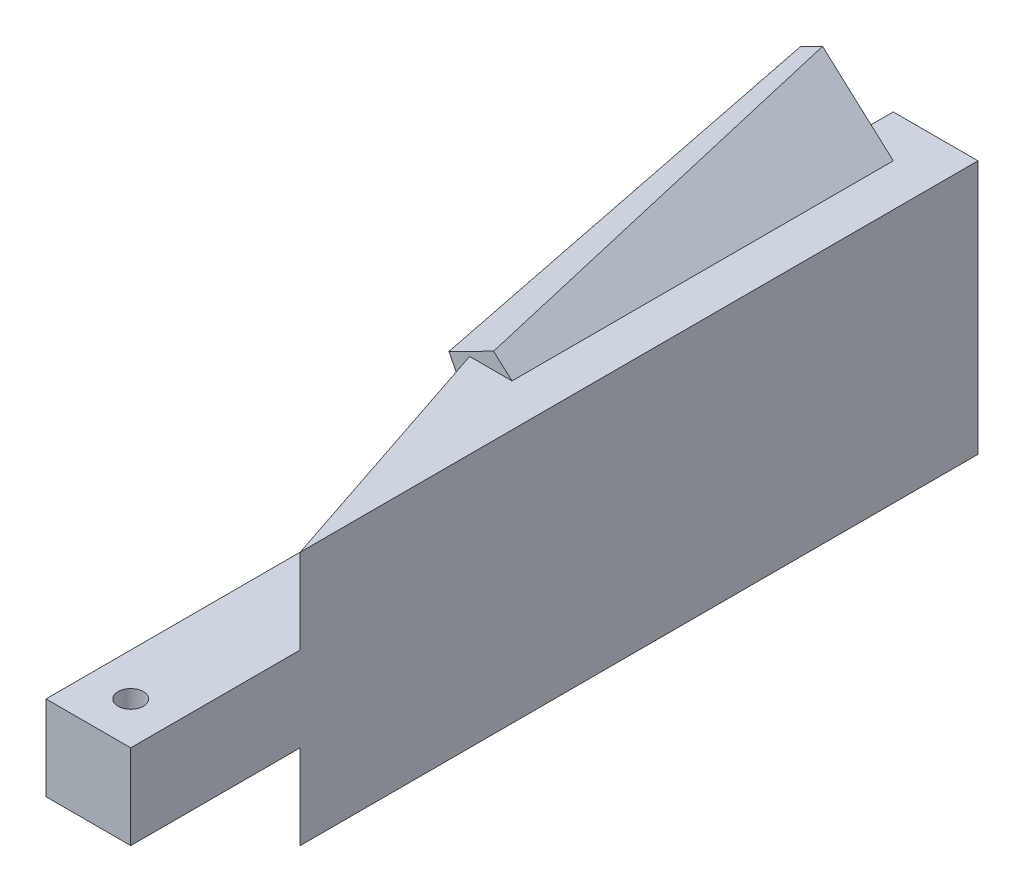
ISO-10303-21;
HEADER;
FILE_DESCRIPTION(('STEP AP214'),'2;1');
FILE_NAME('part.step','',(''),(''),'','','');
FILE_SCHEMA(('AUTOMOTIVE_DESIGN { 1 0 10303 214 1 1 1 1 }'));
ENDSEC;
DATA;
#1=APPLICATION_CONTEXT('core data for automotive mechanical design processes');
#2=APPLICATION_PROTOCOL_DEFINITION('international standard','automotive_design',2000,#1);
#3=PRODUCT_CONTEXT('',#1,'mechanical');
#4=PRODUCT('Part','Part','',(#3));
#5=PRODUCT_RELATED_PRODUCT_CATEGORY('part','',(#4));
#6=PRODUCT_DEFINITION_FORMATION('','',#4);
#7=PRODUCT_DEFINITION_CONTEXT('part definition',#1,'design');
#8=PRODUCT_DEFINITION('design','',#6,#7);
#9=PRODUCT_DEFINITION_SHAPE('','',#8);
#10=(LENGTH_UNIT() NAMED_UNIT(*) SI_UNIT(.MILLI.,.METRE.));
#11=(NAMED_UNIT(*) PLANE_ANGLE_UNIT() SI_UNIT($,.RADIAN.));
#12=(NAMED_UNIT(*) SI_UNIT($,.STERADIAN.) SOLID_ANGLE_UNIT());
#13=UNCERTAINTY_MEASURE_WITH_UNIT(LENGTH_MEASURE(1.E-05),#10,'distance_accuracy_value','');
#14=(GEOMETRIC_REPRESENTATION_CONTEXT(3) GLOBAL_UNCERTAINTY_ASSIGNED_CONTEXT((#13)) GLOBAL_UNIT_ASSIGNED_CONTEXT((#10,
#11,#12)) REPRESENTATION_CONTEXT('',''));
#15=CARTESIAN_POINT('',(0.,0.,0.));
#16=DIRECTION('',(0.,0.,1.));
#17=DIRECTION('',(1.,0.,0.));
#18=AXIS2_PLACEMENT_3D('',#15,#16,#17);
#19=CARTESIAN_POINT('',(19.0641266594902,-21.2208507290396,55.));
#20=DIRECTION('',(0.892764725443748,-0.450523190305836,0.));
#21=DIRECTION('',(0.450523190305836,0.892764725443748,0.));
#22=AXIS2_PLACEMENT_3D('',#19,#20,#21);
#23=PLANE('',#22);
#24=DIRECTION('',(0.450523190305836,0.892764725443748,0.));
#25=VECTOR('',#24,1.);
#26=CARTESIAN_POINT('',(19.0641266594902,-21.2208507290396,10.));
#27=LINE('',#26,#25);
#28=CARTESIAN_POINT('',(19.0641266594902,-21.2208507290395,10.));
#29=VERTEX_POINT('',#28);
#30=CARTESIAN_POINT('',(25.,-9.45821908845376,10.));
#31=VERTEX_POINT('',#30);
#32=EDGE_CURVE('E187',#29,#31,#27,.T.);
#33=ORIENTED_EDGE('',*,*,#32,.F.);
#34=DIRECTION('',(0.0765279350435817,0.151649110163631,0.985467413233205));
#35=VECTOR('',#34,1.);
#36=CARTESIAN_POINT('',(22.558668468501,-14.2960048480642,55.));
#37=LINE('',#36,#35);
#38=CARTESIAN_POINT('',(22.558668468501,-14.2960048480642,55.));
#39=VERTEX_POINT('',#38);
#40=EDGE_CURVE('E191',#29,#39,#37,.T.);
#41=ORIENTED_EDGE('',*,*,#40,.T.);
#42=DIRECTION('',(-0.450523190305836,-0.892764725443748,0.));
#43=VECTOR('',#42,1.);
#44=CARTESIAN_POINT('',(19.0641266594902,-21.2208507290396,55.));
#45=LINE('',#44,#43);
#46=CARTESIAN_POINT('',(25.,-9.45821908845373,55.));
#47=VERTEX_POINT('',#46);
#48=EDGE_CURVE('E200',#47,#39,#45,.T.);
#49=ORIENTED_EDGE('',*,*,#48,.F.);
#50=DIRECTION('',(0.,0.,-1.));
#51=VECTOR('',#50,1.);
#52=CARTESIAN_POINT('',(25.,-9.45821908845373,55.));
#53=LINE('',#52,#51);
#54=EDGE_CURVE('E204',#47,#31,#53,.T.);
#55=ORIENTED_EDGE('',*,*,#54,.T.);
#56=EDGE_LOOP('',(#33,#41,#49,#55));
#57=FACE_BOUND('',#56,.T.);
#58=ADVANCED_FACE('F38',(#57),#23,.F.);
#59=CARTESIAN_POINT('',(30.,-15.,55.));
#60=DIRECTION('',(-0.669881862241489,0.742467703432193,0.));
#61=DIRECTION('',(-0.742467703432193,-0.669881862241489,0.));
#62=AXIS2_PLACEMENT_3D('',#59,#60,#61);
#63=PLANE('',#62);
#64=DIRECTION('',(-0.742467703432193,-0.669881862241489,0.));
#65=VECTOR('',#64,1.);
#66=CARTESIAN_POINT('',(30.,-15.,10.));
#67=LINE('',#66,#65);
#68=CARTESIAN_POINT('',(30.,-15.,10.));
#69=VERTEX_POINT('',#68);
#70=CARTESIAN_POINT('',(21.6556139021278,-22.5286142045842,10.));
#71=VERTEX_POINT('',#70);
#72=EDGE_CURVE('E53',#69,#71,#67,.T.);
#73=ORIENTED_EDGE('',*,*,#72,.F.);
#74=DIRECTION('',(0.,0.,-1.));
#75=VECTOR('',#74,1.);
#76=CARTESIAN_POINT('',(30.,-15.,55.));
#77=LINE('',#76,#75);
#78=CARTESIAN_POINT('',(30.,-15.,55.));
#79=VERTEX_POINT('',#78);
#80=EDGE_CURVE('E203',#79,#69,#77,.T.);
#81=ORIENTED_EDGE('',*,*,#80,.F.);
#82=DIRECTION('',(0.742467703432193,0.669881862241489,0.));
#83=VECTOR('',#82,1.);
#84=CARTESIAN_POINT('',(30.,-15.,55.));
#85=LINE('',#84,#83);
#86=CARTESIAN_POINT('',(27.8312326849423,-16.9567422004532,55.));
#87=VERTEX_POINT('',#86);
#88=EDGE_CURVE('E197',#87,#79,#85,.T.);
#89=ORIENTED_EDGE('',*,*,#88,.F.);
#90=DIRECTION('',(0.13495005262416,0.121756935882283,0.983343140445539));
#91=VECTOR('',#90,1.);
#92=CARTESIAN_POINT('',(27.902880663493,-16.8920987404407,55.52207870145));
#93=LINE('',#92,#91);
#94=EDGE_CURVE('E12',#71,#87,#93,.T.);
#95=ORIENTED_EDGE('',*,*,#94,.F.);
#96=EDGE_LOOP('',(#73,#81,#89,#95));
#97=FACE_BOUND('',#96,.T.);
#98=ADVANCED_FACE('F323',(#97),#63,.F.);
#99=CARTESIAN_POINT('',(35.,-90.5,5.));
#100=DIRECTION('',(0.,0.,-1.));
#101=DIRECTION('',(-1.,0.,0.));
#102=AXIS2_PLACEMENT_3D('',#99,#100,#101);
#103=PLANE('',#102);
#104=DIRECTION('',(0.,1.,0.));
#105=VECTOR('',#104,1.);
#106=CARTESIAN_POINT('',(25.,-90.5,5.));
#107=LINE('',#106,#105);
#108=CARTESIAN_POINT('',(25.,-15.,5.));
#109=VERTEX_POINT('',#108);
#110=CARTESIAN_POINT('',(25.,15.,5.));
#111=VERTEX_POINT('',#110);
#112=EDGE_CURVE('E234',#109,#111,#107,.T.);
#113=ORIENTED_EDGE('',*,*,#112,.T.);
#114=DIRECTION('',(1.,0.,0.));
#115=VECTOR('',#114,1.);
#116=CARTESIAN_POINT('',(35.,15.,5.));
#117=LINE('',#116,#115);
#118=CARTESIAN_POINT('',(35.,15.,5.));
#119=VERTEX_POINT('',#118);
#120=EDGE_CURVE('E46',#111,#119,#117,.T.);
#121=ORIENTED_EDGE('',*,*,#120,.T.);
#122=DIRECTION('',(0.,1.,0.));
#123=VECTOR('',#122,1.);
#124=CARTESIAN_POINT('',(35.,-90.5,5.));
#125=LINE('',#124,#123);
#126=CARTESIAN_POINT('',(35.,-15.,5.));
#127=VERTEX_POINT('',#126);
#128=EDGE_CURVE('E233',#127,#119,#125,.T.);
#129=ORIENTED_EDGE('',*,*,#128,.F.);
#130=DIRECTION('',(-1.,0.,0.));
#131=VECTOR('',#130,1.);
#132=CARTESIAN_POINT('',(35.,-15.,5.));
#133=LINE('',#132,#131);
#134=EDGE_CURVE('E287',#127,#109,#133,.T.);
#135=ORIENTED_EDGE('',*,*,#134,.T.);
#136=EDGE_LOOP('',(#113,#121,#129,#135));
#137=FACE_BOUND('',#136,.T.);
#138=ADVANCED_FACE('F295',(#137),#103,.T.);
#139=CARTESIAN_POINT('',(30.,15.,55.));
#140=DIRECTION('',(0.669881862241489,0.742467703432193,0.));
#141=DIRECTION('',(-0.742467703432193,0.669881862241489,0.));
#142=AXIS2_PLACEMENT_3D('',#139,#140,#141);
#143=PLANE('',#142);
#144=DIRECTION('',(0.,0.,-1.));
#145=VECTOR('',#144,1.);
#146=CARTESIAN_POINT('',(30.,15.,55.));
#147=LINE('',#146,#145);
#148=CARTESIAN_POINT('',(30.,15.,55.));
#149=VERTEX_POINT('',#148);
#150=CARTESIAN_POINT('',(30.,15.,10.));
#151=VERTEX_POINT('',#150);
#152=EDGE_CURVE('E227',#149,#151,#147,.T.);
#153=ORIENTED_EDGE('',*,*,#152,.T.);
#154=DIRECTION('',(-0.742467703432193,0.669881862241489,0.));
#155=VECTOR('',#154,1.);
#156=CARTESIAN_POINT('',(30.,15.,10.));
#157=LINE('',#156,#155);
#158=CARTESIAN_POINT('',(21.6556139021278,22.5286142045842,10.));
#159=VERTEX_POINT('',#158);
#160=EDGE_CURVE('E179',#151,#159,#157,.T.);
#161=ORIENTED_EDGE('',*,*,#160,.T.);
#162=DIRECTION('',(-0.13495005262416,0.121756935882283,-0.983343140445539));
#163=VECTOR('',#162,1.);
#164=CARTESIAN_POINT('',(27.902880663493,16.8920987404407,55.52207870145));
#165=LINE('',#164,#163);
#166=CARTESIAN_POINT('',(27.8312326849423,16.9567422004532,55.));
#167=VERTEX_POINT('',#166);
#168=EDGE_CURVE('E218',#167,#159,#165,.T.);
#169=ORIENTED_EDGE('',*,*,#168,.F.);
#170=DIRECTION('',(0.742467703432193,-0.669881862241489,0.));
#171=VECTOR('',#170,1.);
#172=CARTESIAN_POINT('',(30.,15.,55.));
#173=LINE('',#172,#171);
#174=EDGE_CURVE('E225',#167,#149,#173,.T.);
#175=ORIENTED_EDGE('',*,*,#174,.T.);
#176=EDGE_LOOP('',(#153,#161,#169,#175));
#177=FACE_BOUND('',#176,.T.);
#178=ADVANCED_FACE('F353',(#177),#143,.T.);
#179=CARTESIAN_POINT('',(19.0641266594902,21.2208507290396,55.));
#180=DIRECTION('',(-0.892764725443748,-0.450523190305836,0.));
#181=DIRECTION('',(0.450523190305836,-0.892764725443748,0.));
#182=AXIS2_PLACEMENT_3D('',#179,#180,#181);
#183=PLANE('',#182);
#184=DIRECTION('',(0.0765279350435817,-0.151649110163631,0.985467413233205));
#185=VECTOR('',#184,1.);
#186=CARTESIAN_POINT('',(22.558668468501,14.2960048480642,55.));
#187=LINE('',#186,#185);
#188=CARTESIAN_POINT('',(19.0641266594902,21.2208507290396,9.99999999999999));
#189=VERTEX_POINT('',#188);
#190=CARTESIAN_POINT('',(22.558668468501,14.2960048480642,55.));
#191=VERTEX_POINT('',#190);
#192=EDGE_CURVE('E212',#189,#191,#187,.T.);
#193=ORIENTED_EDGE('',*,*,#192,.F.);
#194=DIRECTION('',(0.450523190305836,-0.892764725443748,0.));
#195=VECTOR('',#194,1.);
#196=CARTESIAN_POINT('',(19.0641266594902,21.2208507290396,10.));
#197=LINE('',#196,#195);
#198=CARTESIAN_POINT('',(25.,9.45821908845373,10.));
#199=VERTEX_POINT('',#198);
#200=EDGE_CURVE('E61',#189,#199,#197,.T.);
#201=ORIENTED_EDGE('',*,*,#200,.T.);
#202=DIRECTION('',(0.,0.,-1.));
#203=VECTOR('',#202,1.);
#204=CARTESIAN_POINT('',(25.,9.45821908845373,55.));
#205=LINE('',#204,#203);
#206=CARTESIAN_POINT('',(25.,9.45821908845373,55.));
#207=VERTEX_POINT('',#206);
#208=EDGE_CURVE('E162',#207,#199,#205,.T.);
#209=ORIENTED_EDGE('',*,*,#208,.F.);
#210=DIRECTION('',(-0.450523190305836,0.892764725443748,0.));
#211=VECTOR('',#210,1.);
#212=CARTESIAN_POINT('',(19.0641266594902,21.2208507290396,55.));
#213=LINE('',#212,#211);
#214=EDGE_CURVE('E222',#207,#191,#213,.T.);
#215=ORIENTED_EDGE('',*,*,#214,.T.);
#216=EDGE_LOOP('',(#193,#201,#209,#215));
#217=FACE_BOUND('',#216,.T.);
#218=ADVANCED_FACE('F356',(#217),#183,.T.);
#219=CARTESIAN_POINT('',(0.,0.,55.));
#220=DIRECTION('',(0.,0.,1.));
#221=DIRECTION('',(1.,0.,0.));
#222=AXIS2_PLACEMENT_3D('',#219,#220,#221);
#223=PLANE('',#222);
#224=ORIENTED_EDGE('',*,*,#48,.T.);
#225=DIRECTION('',(-0.892764725443748,0.450523190305836,0.));
#226=VECTOR('',#225,1.);
#227=CARTESIAN_POINT('',(49.3416102318135,-27.8117005572393,55.));
#228=LINE('',#227,#226);
#229=EDGE_CURVE('E194',#87,#39,#228,.T.);
#230=ORIENTED_EDGE('',*,*,#229,.F.);
#231=ORIENTED_EDGE('',*,*,#88,.T.);
#232=DIRECTION('',(1.,0.,0.));
#233=VECTOR('',#232,1.);
#234=CARTESIAN_POINT('',(25.,-15.,55.));
#235=LINE('',#234,#233);
#236=CARTESIAN_POINT('',(25.,-15.,55.));
#237=VERTEX_POINT('',#236);
#238=EDGE_CURVE('E207',#237,#79,#235,.T.);
#239=ORIENTED_EDGE('',*,*,#238,.F.);
#240=DIRECTION('',(0.,-1.,0.));
#241=VECTOR('',#240,1.);
#242=CARTESIAN_POINT('',(25.,-5.00000000000003,55.));
#243=LINE('',#242,#241);
#244=EDGE_CURVE('E269',#47,#237,#243,.T.);
#245=ORIENTED_EDGE('',*,*,#244,.F.);
#246=EDGE_LOOP('',(#224,#230,#231,#239,#245));
#247=FACE_BOUND('',#246,.T.);
#248=ADVANCED_FACE('F315',(#247),#223,.T.);
#249=CARTESIAN_POINT('',(25.,-15.,105.));
#250=DIRECTION('',(1.,0.,0.));
#251=DIRECTION('',(0.,0.,-1.));
#252=AXIS2_PLACEMENT_3D('',#249,#250,#251);
#253=PLANE('',#252);
#254=ORIENTED_EDGE('',*,*,#112,.F.);
#255=DIRECTION('',(0.,0.,-1.));
#256=VECTOR('',#255,1.);
#257=CARTESIAN_POINT('',(25.,-15.,10.));
#258=LINE('',#257,#256);
#259=CARTESIAN_POINT('',(25.,-15.,10.));
#260=VERTEX_POINT('',#259);
#261=EDGE_CURVE('E175',#260,#109,#258,.T.);
#262=ORIENTED_EDGE('',*,*,#261,.F.);
#263=DIRECTION('',(0.,1.,0.));
#264=VECTOR('',#263,1.);
#265=CARTESIAN_POINT('',(25.,15.,10.));
#266=LINE('',#265,#264);
#267=EDGE_CURVE('E164',#260,#31,#266,.T.);
#268=ORIENTED_EDGE('',*,*,#267,.T.);
#269=ORIENTED_EDGE('',*,*,#54,.F.);
#270=CARTESIAN_POINT('',(25.,-5.00000000000003,55.));
#271=VERTEX_POINT('',#270);
#272=EDGE_CURVE('E275',#271,#47,#243,.T.);
#273=ORIENTED_EDGE('',*,*,#272,.F.);
#274=DIRECTION('',(0.,0.,-1.));
#275=VECTOR('',#274,1.);
#276=CARTESIAN_POINT('',(25.,-5.00000000000003,95.));
#277=LINE('',#276,#275);
#278=CARTESIAN_POINT('',(25.,-5.00000000000003,105.));
#279=VERTEX_POINT('',#278);
#280=EDGE_CURVE('E264',#279,#271,#277,.T.);
#281=ORIENTED_EDGE('',*,*,#280,.F.);
#282=DIRECTION('',(0.,-1.,0.));
#283=VECTOR('',#282,1.);
#284=CARTESIAN_POINT('',(25.,-15.,105.));
#285=LINE('',#284,#283);
#286=CARTESIAN_POINT('',(25.,5.00000000000003,105.));
#287=VERTEX_POINT('',#286);
#288=EDGE_CURVE('E281',#287,#279,#285,.T.);
#289=ORIENTED_EDGE('',*,*,#288,.F.);
#290=DIRECTION('',(0.,0.,-1.));
#291=VECTOR('',#290,1.);
#292=CARTESIAN_POINT('',(25.,5.00000000000003,55.));
#293=LINE('',#292,#291);
#294=CARTESIAN_POINT('',(25.,5.00000000000003,55.));
#295=VERTEX_POINT('',#294);
#296=EDGE_CURVE('E244',#287,#295,#293,.T.);
#297=ORIENTED_EDGE('',*,*,#296,.T.);
#298=DIRECTION('',(0.,1.,0.));
#299=VECTOR('',#298,1.);
#300=CARTESIAN_POINT('',(25.,5.00000000000003,55.));
#301=LINE('',#300,#299);
#302=EDGE_CURVE('E253',#295,#207,#301,.T.);
#303=ORIENTED_EDGE('',*,*,#302,.T.);
#304=ORIENTED_EDGE('',*,*,#208,.T.);
#305=CARTESIAN_POINT('',(25.,15.,10.));
#306=VERTEX_POINT('',#305);
#307=EDGE_CURVE('E156',#199,#306,#266,.T.);
#308=ORIENTED_EDGE('',*,*,#307,.T.);
#309=DIRECTION('',(0.,0.,-1.));
#310=VECTOR('',#309,1.);
#311=CARTESIAN_POINT('',(25.,15.,10.));
#312=LINE('',#311,#310);
#313=EDGE_CURVE('E159',#306,#111,#312,.T.);
#314=ORIENTED_EDGE('',*,*,#313,.T.);
#315=EDGE_LOOP('',(#254,#262,#268,#269,#273,#281,#289,#297,#303,#304,#308,#314));
#316=FACE_BOUND('',#315,.T.);
#317=ADVANCED_FACE('F158',(#316),#253,.F.);
#318=CARTESIAN_POINT('',(25.,-15.,105.));
#319=DIRECTION('',(0.,1.,0.));
#320=DIRECTION('',(-1.,0.,0.));
#321=AXIS2_PLACEMENT_3D('',#318,#319,#320);
#322=PLANE('',#321);
#323=ORIENTED_EDGE('',*,*,#134,.F.);
#324=DIRECTION('',(0.,0.,-1.));
#325=VECTOR('',#324,1.);
#326=CARTESIAN_POINT('',(35.,-15.,105.));
#327=LINE('',#326,#325);
#328=CARTESIAN_POINT('',(35.,-15.,85.));
#329=VERTEX_POINT('',#328);
#330=EDGE_CURVE('E283',#329,#127,#327,.T.);
#331=ORIENTED_EDGE('',*,*,#330,.F.);
#332=DIRECTION('',(0.316227766016838,0.,0.948683298050514));
#333=VECTOR('',#332,1.);
#334=CARTESIAN_POINT('',(35.,-15.,85.));
#335=LINE('',#334,#333);
#336=EDGE_CURVE('E261',#237,#329,#335,.T.);
#337=ORIENTED_EDGE('',*,*,#336,.F.);
#338=ORIENTED_EDGE('',*,*,#238,.T.);
#339=ORIENTED_EDGE('',*,*,#80,.T.);
#340=DIRECTION('',(-1.,0.,0.));
#341=VECTOR('',#340,1.);
#342=CARTESIAN_POINT('',(35.,-15.,10.));
#343=LINE('',#342,#341);
#344=EDGE_CURVE('E165',#69,#260,#343,.T.);
#345=ORIENTED_EDGE('',*,*,#344,.T.);
#346=ORIENTED_EDGE('',*,*,#261,.T.);
#347=EDGE_LOOP('',(#323,#331,#337,#338,#339,#345,#346));
#348=FACE_BOUND('',#347,.T.);
#349=ADVANCED_FACE('F304',(#348),#322,.F.);
#350=CARTESIAN_POINT('',(35.,-15.,105.));
#351=DIRECTION('',(-1.,0.,0.));
#352=DIRECTION('',(0.,0.,1.));
#353=AXIS2_PLACEMENT_3D('',#350,#351,#352);
#354=PLANE('',#353);
#355=ORIENTED_EDGE('',*,*,#128,.T.);
#356=DIRECTION('',(0.,0.,-1.));
#357=VECTOR('',#356,1.);
#358=CARTESIAN_POINT('',(35.,15.,105.));
#359=LINE('',#358,#357);
#360=CARTESIAN_POINT('',(35.,15.,85.));
#361=VERTEX_POINT('',#360);
#362=EDGE_CURVE('E285',#361,#119,#359,.T.);
#363=ORIENTED_EDGE('',*,*,#362,.F.);
#364=DIRECTION('',(0.,1.,0.));
#365=VECTOR('',#364,1.);
#366=CARTESIAN_POINT('',(35.,5.00000000000003,85.));
#367=LINE('',#366,#365);
#368=CARTESIAN_POINT('',(35.,5.00000000000003,85.));
#369=VERTEX_POINT('',#368);
#370=EDGE_CURVE('E250',#369,#361,#367,.T.);
#371=ORIENTED_EDGE('',*,*,#370,.F.);
#372=DIRECTION('',(0.,0.,1.));
#373=VECTOR('',#372,1.);
#374=CARTESIAN_POINT('',(35.,5.00000000000003,85.));
#375=LINE('',#374,#373);
#376=CARTESIAN_POINT('',(35.,5.00000000000003,105.));
#377=VERTEX_POINT('',#376);
#378=EDGE_CURVE('E239',#369,#377,#375,.T.);
#379=ORIENTED_EDGE('',*,*,#378,.T.);
#380=DIRECTION('',(0.,1.,0.));
#381=VECTOR('',#380,1.);
#382=CARTESIAN_POINT('',(35.,-15.,105.));
#383=LINE('',#382,#381);
#384=CARTESIAN_POINT('',(35.,-5.00000000000003,105.));
#385=VERTEX_POINT('',#384);
#386=EDGE_CURVE('E278',#385,#377,#383,.T.);
#387=ORIENTED_EDGE('',*,*,#386,.F.);
#388=DIRECTION('',(0.,0.,1.));
#389=VECTOR('',#388,1.);
#390=CARTESIAN_POINT('',(35.,-5.00000000000003,85.));
#391=LINE('',#390,#389);
#392=CARTESIAN_POINT('',(35.,-5.00000000000003,85.));
#393=VERTEX_POINT('',#392);
#394=EDGE_CURVE('E258',#393,#385,#391,.T.);
#395=ORIENTED_EDGE('',*,*,#394,.F.);
#396=DIRECTION('',(0.,-1.,0.));
#397=VECTOR('',#396,1.);
#398=CARTESIAN_POINT('',(35.,-5.00000000000003,85.));
#399=LINE('',#398,#397);
#400=EDGE_CURVE('E271',#393,#329,#399,.T.);
#401=ORIENTED_EDGE('',*,*,#400,.T.);
#402=ORIENTED_EDGE('',*,*,#330,.T.);
#403=EDGE_LOOP('',(#355,#363,#371,#379,#387,#395,#401,#402));
#404=FACE_BOUND('',#403,.T.);
#405=ADVANCED_FACE('F40',(#404),#354,.F.);
#406=CARTESIAN_POINT('',(25.,15.,105.));
#407=DIRECTION('',(0.,-1.,0.));
#408=DIRECTION('',(1.,0.,0.));
#409=AXIS2_PLACEMENT_3D('',#406,#407,#408);
#410=PLANE('',#409);
#411=ORIENTED_EDGE('',*,*,#120,.F.);
#412=ORIENTED_EDGE('',*,*,#313,.F.);
#413=DIRECTION('',(1.,0.,0.));
#414=VECTOR('',#413,1.);
#415=CARTESIAN_POINT('',(35.,15.,10.));
#416=LINE('',#415,#414);
#417=EDGE_CURVE('E171',#306,#151,#416,.T.);
#418=ORIENTED_EDGE('',*,*,#417,.T.);
#419=ORIENTED_EDGE('',*,*,#152,.F.);
#420=DIRECTION('',(-1.,0.,0.));
#421=VECTOR('',#420,1.);
#422=CARTESIAN_POINT('',(25.,15.,55.));
#423=LINE('',#422,#421);
#424=CARTESIAN_POINT('',(25.,15.,55.));
#425=VERTEX_POINT('',#424);
#426=EDGE_CURVE('E229',#149,#425,#423,.T.);
#427=ORIENTED_EDGE('',*,*,#426,.T.);
#428=DIRECTION('',(0.316227766016838,0.,0.948683298050514));
#429=VECTOR('',#428,1.);
#430=CARTESIAN_POINT('',(35.,15.,85.));
#431=LINE('',#430,#429);
#432=EDGE_CURVE('E236',#425,#361,#431,.T.);
#433=ORIENTED_EDGE('',*,*,#432,.T.);
#434=ORIENTED_EDGE('',*,*,#362,.T.);
#435=EDGE_LOOP('',(#411,#412,#418,#419,#427,#433,#434));
#436=FACE_BOUND('',#435,.T.);
#437=ADVANCED_FACE('F169',(#436),#410,.F.);
#438=CARTESIAN_POINT('',(0.,0.,105.));
#439=DIRECTION('',(0.,0.,-1.));
#440=DIRECTION('',(-1.,0.,0.));
#441=AXIS2_PLACEMENT_3D('',#438,#439,#440);
#442=PLANE('',#441);
#443=ORIENTED_EDGE('',*,*,#386,.T.);
#444=DIRECTION('',(-1.,0.,0.));
#445=VECTOR('',#444,1.);
#446=CARTESIAN_POINT('',(25.,5.00000000000003,105.));
#447=LINE('',#446,#445);
#448=EDGE_CURVE('E247',#377,#287,#447,.T.);
#449=ORIENTED_EDGE('',*,*,#448,.T.);
#450=ORIENTED_EDGE('',*,*,#288,.T.);
#451=DIRECTION('',(-1.,0.,0.));
#452=VECTOR('',#451,1.);
#453=CARTESIAN_POINT('',(25.,-5.00000000000003,105.));
#454=LINE('',#453,#452);
#455=EDGE_CURVE('E260',#385,#279,#454,.T.);
#456=ORIENTED_EDGE('',*,*,#455,.F.);
#457=EDGE_LOOP('',(#443,#449,#450,#456));
#458=FACE_BOUND('',#457,.T.);
#459=ADVANCED_FACE('F379',(#458),#442,.F.);
#460=CARTESIAN_POINT('',(30.,35.,100.));
#461=DIRECTION('',(0.,-1.,0.));
#462=DIRECTION('',(1.,0.,0.));
#463=AXIS2_PLACEMENT_3D('',#460,#461,#462);
#464=CYLINDRICAL_SURFACE('',#463,1.50000000000001);
#465=CARTESIAN_POINT('',(30.,5.00000000000003,100.));
#466=DIRECTION('',(0.,-1.,0.));
#467=DIRECTION('',(1.,0.,0.));
#468=AXIS2_PLACEMENT_3D('',#465,#466,#467);
#469=CIRCLE('',#468,1.50000000000001);
#470=CARTESIAN_POINT('',(31.5,5.00000000000003,100.));
#471=VERTEX_POINT('',#470);
#472=EDGE_CURVE('E255',#471,#471,#469,.F.);
#473=ORIENTED_EDGE('',*,*,#472,.T.);
#474=EDGE_LOOP('',(#473));
#475=FACE_BOUND('',#474,.T.);
#476=CARTESIAN_POINT('',(30.,-5.00000000000003,100.));
#477=DIRECTION('',(0.,1.,0.));
#478=DIRECTION('',(-1.,0.,0.));
#479=AXIS2_PLACEMENT_3D('',#476,#477,#478);
#480=CIRCLE('',#479,1.50000000000001);
#481=CARTESIAN_POINT('',(28.5,-5.00000000000003,100.));
#482=VERTEX_POINT('',#481);
#483=EDGE_CURVE('E274',#482,#482,#480,.F.);
#484=ORIENTED_EDGE('',*,*,#483,.T.);
#485=EDGE_LOOP('',(#484));
#486=FACE_BOUND('',#485,.T.);
#487=ADVANCED_FACE('F373',(#475,#486),#464,.F.);
#488=CARTESIAN_POINT('',(0.,-5.00000000000002,0.));
#489=DIRECTION('',(0.,1.,0.));
#490=DIRECTION('',(-1.,0.,0.));
#491=AXIS2_PLACEMENT_3D('',#488,#489,#490);
#492=PLANE('',#491);
#493=ORIENTED_EDGE('',*,*,#394,.T.);
#494=ORIENTED_EDGE('',*,*,#455,.T.);
#495=ORIENTED_EDGE('',*,*,#280,.T.);
#496=DIRECTION('',(0.316227766016838,0.,0.948683298050514));
#497=VECTOR('',#496,1.);
#498=CARTESIAN_POINT('',(35.,-5.00000000000003,85.));
#499=LINE('',#498,#497);
#500=EDGE_CURVE('E266',#271,#393,#499,.T.);
#501=ORIENTED_EDGE('',*,*,#500,.T.);
#502=EDGE_LOOP('',(#493,#494,#495,#501));
#503=FACE_BOUND('',#502,.T.);
#504=ORIENTED_EDGE('',*,*,#483,.F.);
#505=EDGE_LOOP('',(#504));
#506=FACE_BOUND('',#505,.T.);
#507=ADVANCED_FACE('F370',(#503,#506),#492,.F.);
#508=CARTESIAN_POINT('',(35.,-5.00000000000003,85.));
#509=DIRECTION('',(0.948683298050514,0.,-0.316227766016838));
#510=DIRECTION('',(-0.316227766016838,0.,-0.948683298050514));
#511=AXIS2_PLACEMENT_3D('',#508,#509,#510);
#512=PLANE('',#511);
#513=ORIENTED_EDGE('',*,*,#336,.T.);
#514=ORIENTED_EDGE('',*,*,#400,.F.);
#515=ORIENTED_EDGE('',*,*,#500,.F.);
#516=ORIENTED_EDGE('',*,*,#272,.T.);
#517=ORIENTED_EDGE('',*,*,#244,.T.);
#518=EDGE_LOOP('',(#513,#514,#515,#516,#517));
#519=FACE_BOUND('',#518,.T.);
#520=ADVANCED_FACE('F319',(#519),#512,.F.);
#521=CARTESIAN_POINT('',(0.,5.00000000000002,0.));
#522=DIRECTION('',(0.,-1.,0.));
#523=DIRECTION('',(-1.,0.,0.));
#524=AXIS2_PLACEMENT_3D('',#521,#522,#523);
#525=PLANE('',#524);
#526=ORIENTED_EDGE('',*,*,#378,.F.);
#527=DIRECTION('',(0.316227766016838,0.,0.948683298050514));
#528=VECTOR('',#527,1.);
#529=CARTESIAN_POINT('',(35.,5.00000000000003,85.));
#530=LINE('',#529,#528);
#531=EDGE_CURVE('E242',#295,#369,#530,.T.);
#532=ORIENTED_EDGE('',*,*,#531,.F.);
#533=ORIENTED_EDGE('',*,*,#296,.F.);
#534=ORIENTED_EDGE('',*,*,#448,.F.);
#535=EDGE_LOOP('',(#526,#532,#533,#534));
#536=FACE_BOUND('',#535,.T.);
#537=ORIENTED_EDGE('',*,*,#472,.F.);
#538=EDGE_LOOP('',(#537));
#539=FACE_BOUND('',#538,.T.);
#540=ADVANCED_FACE('F363',(#536,#539),#525,.F.);
#541=CARTESIAN_POINT('',(35.,5.00000000000003,85.));
#542=DIRECTION('',(-0.948683298050514,0.,0.316227766016838));
#543=DIRECTION('',(0.316227766016838,0.,0.948683298050514));
#544=AXIS2_PLACEMENT_3D('',#541,#542,#543);
#545=PLANE('',#544);
#546=ORIENTED_EDGE('',*,*,#432,.F.);
#547=EDGE_CURVE('E256',#207,#425,#301,.T.);
#548=ORIENTED_EDGE('',*,*,#547,.F.);
#549=ORIENTED_EDGE('',*,*,#302,.F.);
#550=ORIENTED_EDGE('',*,*,#531,.T.);
#551=ORIENTED_EDGE('',*,*,#370,.T.);
#552=EDGE_LOOP('',(#546,#548,#549,#550,#551));
#553=FACE_BOUND('',#552,.T.);
#554=ADVANCED_FACE('F351',(#553),#545,.T.);
#555=CARTESIAN_POINT('',(0.,0.,55.));
#556=DIRECTION('',(0.,0.,1.));
#557=DIRECTION('',(1.,0.,0.));
#558=AXIS2_PLACEMENT_3D('',#555,#556,#557);
#559=PLANE('',#558);
#560=DIRECTION('',(-0.892764725443748,-0.450523190305836,0.));
#561=VECTOR('',#560,1.);
#562=CARTESIAN_POINT('',(49.3416102318135,27.8117005572393,55.));
#563=LINE('',#562,#561);
#564=EDGE_CURVE('E215',#167,#191,#563,.T.);
#565=ORIENTED_EDGE('',*,*,#564,.T.);
#566=ORIENTED_EDGE('',*,*,#214,.F.);
#567=ORIENTED_EDGE('',*,*,#547,.T.);
#568=ORIENTED_EDGE('',*,*,#426,.F.);
#569=ORIENTED_EDGE('',*,*,#174,.F.);
#570=EDGE_LOOP('',(#565,#566,#567,#568,#569));
#571=FACE_BOUND('',#570,.T.);
#572=ADVANCED_FACE('F347',(#571),#559,.T.);
#573=CARTESIAN_POINT('',(49.3416102318135,27.8117005572393,55.));
#574=DIRECTION('',(0.443975922952263,-0.879790544608903,-0.169864585642375));
#575=DIRECTION('',(0.892764725443748,0.450523190305836,0.));
#576=AXIS2_PLACEMENT_3D('',#573,#574,#575);
#577=PLANE('',#576);
#578=ORIENTED_EDGE('',*,*,#168,.T.);
#579=DIRECTION('',(-0.892764725443748,-0.450523190305836,0.));
#580=VECTOR('',#579,1.);
#581=CARTESIAN_POINT('',(45.8470684228026,34.7365464382146,10.));
#582=LINE('',#581,#580);
#583=EDGE_CURVE('E214',#159,#189,#582,.T.);
#584=ORIENTED_EDGE('',*,*,#583,.T.);
#585=ORIENTED_EDGE('',*,*,#192,.T.);
#586=ORIENTED_EDGE('',*,*,#564,.F.);
#587=EDGE_LOOP('',(#578,#584,#585,#586));
#588=FACE_BOUND('',#587,.T.);
#589=ADVANCED_FACE('F334',(#588),#577,.F.);
#590=CARTESIAN_POINT('',(49.3416102318135,-27.8117005572393,55.));
#591=DIRECTION('',(-0.443975922952263,-0.879790544608903,0.169864585642375));
#592=DIRECTION('',(0.892764725443748,-0.450523190305836,0.));
#593=AXIS2_PLACEMENT_3D('',#590,#591,#592);
#594=PLANE('',#593);
#595=ORIENTED_EDGE('',*,*,#94,.T.);
#596=ORIENTED_EDGE('',*,*,#229,.T.);
#597=ORIENTED_EDGE('',*,*,#40,.F.);
#598=DIRECTION('',(-0.892764725443748,0.450523190305836,0.));
#599=VECTOR('',#598,1.);
#600=CARTESIAN_POINT('',(45.8470684228026,-34.7365464382146,10.));
#601=LINE('',#600,#599);
#602=EDGE_CURVE('E195',#71,#29,#601,.T.);
#603=ORIENTED_EDGE('',*,*,#602,.F.);
#604=EDGE_LOOP('',(#595,#596,#597,#603));
#605=FACE_BOUND('',#604,.T.);
#606=ADVANCED_FACE('F326',(#605),#594,.T.);
#607=CARTESIAN_POINT('',(27.0320633297451,0.,10.));
#608=DIRECTION('',(0.,0.,-1.));
#609=DIRECTION('',(-1.,0.,0.));
#610=AXIS2_PLACEMENT_3D('',#607,#608,#609);
#611=PLANE('',#610);
#612=ORIENTED_EDGE('',*,*,#32,.T.);
#613=ORIENTED_EDGE('',*,*,#267,.F.);
#614=ORIENTED_EDGE('',*,*,#344,.F.);
#615=ORIENTED_EDGE('',*,*,#72,.T.);
#616=ORIENTED_EDGE('',*,*,#602,.T.);
#617=EDGE_LOOP('',(#612,#613,#614,#615,#616));
#618=FACE_BOUND('',#617,.T.);
#619=ADVANCED_FACE('F327',(#618),#611,.T.);
#620=ORIENTED_EDGE('',*,*,#417,.F.);
#621=ORIENTED_EDGE('',*,*,#307,.F.);
#622=ORIENTED_EDGE('',*,*,#200,.F.);
#623=ORIENTED_EDGE('',*,*,#583,.F.);
#624=ORIENTED_EDGE('',*,*,#160,.F.);
#625=EDGE_LOOP('',(#620,#621,#622,#623,#624));
#626=FACE_BOUND('',#625,.T.);
#627=ADVANCED_FACE('F177',(#626),#611,.T.);
#628=CLOSED_SHELL('',(#58,#98,#138,#178,#218,#248,#317,#349,#405,#437,#459,#487,#507,#520,#540,
#554,#572,#589,#606,#619,#627));
#629=MANIFOLD_SOLID_BREP('B2',#628);
#630=ADVANCED_BREP_SHAPE_REPRESENTATION('',(#18,#629),#14);
#631=SHAPE_DEFINITION_REPRESENTATION(#9,#630);
ENDSEC;
END-ISO-10303-21;
